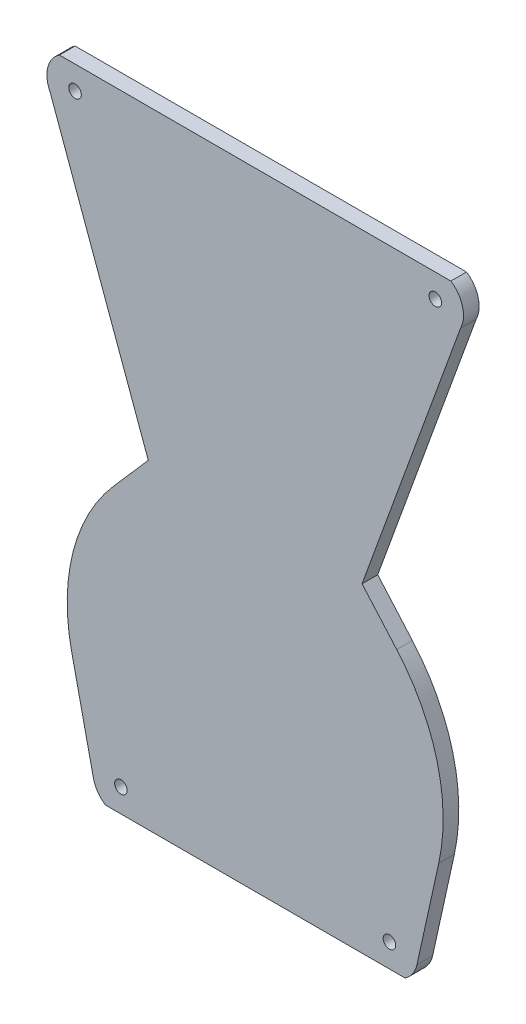
ISO-10303-21;
HEADER;
FILE_DESCRIPTION(('STEP AP214'),'2;1');
FILE_NAME('part.step','',(''),(''),'','','');
FILE_SCHEMA(('AUTOMOTIVE_DESIGN { 1 0 10303 214 1 1 1 1 }'));
ENDSEC;
DATA;
#1=APPLICATION_CONTEXT('core data for automotive mechanical design processes');
#2=APPLICATION_PROTOCOL_DEFINITION('international standard','automotive_design',2000,#1);
#3=PRODUCT_CONTEXT('',#1,'mechanical');
#4=PRODUCT('Part','Part','',(#3));
#5=PRODUCT_RELATED_PRODUCT_CATEGORY('part','',(#4));
#6=PRODUCT_DEFINITION_FORMATION('','',#4);
#7=PRODUCT_DEFINITION_CONTEXT('part definition',#1,'design');
#8=PRODUCT_DEFINITION('design','',#6,#7);
#9=PRODUCT_DEFINITION_SHAPE('','',#8);
#10=(LENGTH_UNIT() NAMED_UNIT(*) SI_UNIT(.MILLI.,.METRE.));
#11=(NAMED_UNIT(*) PLANE_ANGLE_UNIT() SI_UNIT($,.RADIAN.));
#12=(NAMED_UNIT(*) SI_UNIT($,.STERADIAN.) SOLID_ANGLE_UNIT());
#13=UNCERTAINTY_MEASURE_WITH_UNIT(LENGTH_MEASURE(1.E-05),#10,'distance_accuracy_value','');
#14=(GEOMETRIC_REPRESENTATION_CONTEXT(3) GLOBAL_UNCERTAINTY_ASSIGNED_CONTEXT((#13)) GLOBAL_UNIT_ASSIGNED_CONTEXT((#10,
#11,#12)) REPRESENTATION_CONTEXT('',''));
#15=CARTESIAN_POINT('',(0.,0.,0.));
#16=DIRECTION('',(0.,0.,1.));
#17=DIRECTION('',(1.,0.,0.));
#18=AXIS2_PLACEMENT_3D('',#15,#16,#17);
#19=CARTESIAN_POINT('',(0.,0.,0.));
#20=DIRECTION('',(0.,0.,1.));
#21=DIRECTION('',(1.,0.,0.));
#22=AXIS2_PLACEMENT_3D('',#19,#20,#21);
#23=PLANE('',#22);
#24=DIRECTION('',(1.,0.,0.));
#25=VECTOR('',#24,1.);
#26=CARTESIAN_POINT('',(-1.85657584316205E-13,100.,0.));
#27=LINE('',#26,#25);
#28=CARTESIAN_POINT('',(-62.4749371855333,100.,0.));
#29=VERTEX_POINT('',#28);
#30=CARTESIAN_POINT('',(62.474937185533,100.,0.));
#31=VERTEX_POINT('',#30);
#32=EDGE_CURVE('E271',#29,#31,#27,.T.);
#33=ORIENTED_EDGE('',*,*,#32,.T.);
#34=CARTESIAN_POINT('',(57.4999999999999,92.5,0.));
#35=DIRECTION('',(0.,0.,1.));
#36=DIRECTION('',(1.,0.,0.));
#37=AXIS2_PLACEMENT_3D('',#34,#35,#36);
#38=CIRCLE('',#37,9.);
#39=CARTESIAN_POINT('',(65.5369703494013,88.4494312000852,0.));
#40=VERTEX_POINT('',#39);
#41=EDGE_CURVE('E212',#40,#31,#38,.T.);
#42=ORIENTED_EDGE('',*,*,#41,.F.);
#43=DIRECTION('',(0.342020143325673,0.939692620785907,0.));
#44=VECTOR('',#43,1.);
#45=CARTESIAN_POINT('',(29.4435019225878,-10.7165582923818,0.));
#46=LINE('',#45,#44);
#47=CARTESIAN_POINT('',(34.1202353646952,2.13266123661636,0.));
#48=VERTEX_POINT('',#47);
#49=EDGE_CURVE('E307',#48,#40,#46,.T.);
#50=ORIENTED_EDGE('',*,*,#49,.F.);
#51=DIRECTION('',(-0.658159557923822,0.752878473801396,0.));
#52=VECTOR('',#51,1.);
#53=CARTESIAN_POINT('',(20.3970002537093,17.8308732911052,0.));
#54=LINE('',#53,#52);
#55=CARTESIAN_POINT('',(45.1727084280837,-10.5104265245707,0.));
#56=VERTEX_POINT('',#55);
#57=EDGE_CURVE('E304',#56,#48,#54,.T.);
#58=ORIENTED_EDGE('',*,*,#57,.F.);
#59=CARTESIAN_POINT('',(-1.69309011255336E-13,-50.,0.));
#60=DIRECTION('',(0.,0.,1.));
#61=DIRECTION('',(1.,0.,0.));
#62=AXIS2_PLACEMENT_3D('',#59,#60,#61);
#63=CIRCLE('',#62,60.0000000000001);
#64=CARTESIAN_POINT('',(58.5930949635311,-62.9170129130004,0.));
#65=VERTEX_POINT('',#64);
#66=EDGE_CURVE('E301',#65,#56,#63,.T.);
#67=ORIENTED_EDGE('',*,*,#66,.F.);
#68=DIRECTION('',(-0.215283548550007,-0.976551582725519,0.));
#69=VECTOR('',#68,1.);
#70=CARTESIAN_POINT('',(69.1048694670948,-15.2343632268145,0.));
#71=LINE('',#70,#69);
#72=CARTESIAN_POINT('',(51.6443033038567,-94.4375519369501,0.));
#73=VERTEX_POINT('',#72);
#74=EDGE_CURVE('E298',#65,#73,#71,.T.);
#75=ORIENTED_EDGE('',*,*,#74,.T.);
#76=CARTESIAN_POINT('',(42.855339059327,-92.5,0.));
#77=DIRECTION('',(0.,0.,1.));
#78=DIRECTION('',(1.,0.,0.));
#79=AXIS2_PLACEMENT_3D('',#76,#77,#78);
#80=CIRCLE('',#79,9.00000000000002);
#81=CARTESIAN_POINT('',(47.8302762448602,-100.,0.));
#82=VERTEX_POINT('',#81);
#83=EDGE_CURVE('E295',#82,#73,#80,.T.);
#84=ORIENTED_EDGE('',*,*,#83,.F.);
#85=DIRECTION('',(-1.,0.,0.));
#86=VECTOR('',#85,1.);
#87=CARTESIAN_POINT('',(0.,-100.,0.));
#88=LINE('',#87,#86);
#89=CARTESIAN_POINT('',(-47.8302762448605,-100.,0.));
#90=VERTEX_POINT('',#89);
#91=EDGE_CURVE('E292',#82,#90,#88,.T.);
#92=ORIENTED_EDGE('',*,*,#91,.T.);
#93=CARTESIAN_POINT('',(-42.8553390593273,-92.5,0.));
#94=DIRECTION('',(0.,0.,1.));
#95=DIRECTION('',(1.,0.,0.));
#96=AXIS2_PLACEMENT_3D('',#93,#94,#95);
#97=CIRCLE('',#96,9.00000000000002);
#98=CARTESIAN_POINT('',(-51.6443033038571,-94.4375519369501,0.));
#99=VERTEX_POINT('',#98);
#100=EDGE_CURVE('E289',#99,#90,#97,.T.);
#101=ORIENTED_EDGE('',*,*,#100,.F.);
#102=DIRECTION('',(-0.215283548550006,0.976551582725519,0.));
#103=VECTOR('',#102,1.);
#104=CARTESIAN_POINT('',(-69.1048694670951,-15.2343632268146,0.));
#105=LINE('',#104,#103);
#106=CARTESIAN_POINT('',(-58.5930949635314,-62.9170129130004,0.));
#107=VERTEX_POINT('',#106);
#108=EDGE_CURVE('E286',#99,#107,#105,.T.);
#109=ORIENTED_EDGE('',*,*,#108,.T.);
#110=CARTESIAN_POINT('',(-1.69309011255336E-13,-50.,0.));
#111=DIRECTION('',(0.,0.,1.));
#112=DIRECTION('',(1.,0.,0.));
#113=AXIS2_PLACEMENT_3D('',#110,#111,#112);
#114=CIRCLE('',#113,60.);
#115=CARTESIAN_POINT('',(-45.172708428084,-10.5104265245707,0.));
#116=VERTEX_POINT('',#115);
#117=EDGE_CURVE('E283',#116,#107,#114,.T.);
#118=ORIENTED_EDGE('',*,*,#117,.F.);
#119=DIRECTION('',(-0.658159557923822,-0.752878473801396,0.));
#120=VECTOR('',#119,1.);
#121=CARTESIAN_POINT('',(-20.3970002537094,17.8308732911054,0.));
#122=LINE('',#121,#120);
#123=CARTESIAN_POINT('',(-34.1202353646955,2.13266123661635,0.));
#124=VERTEX_POINT('',#123);
#125=EDGE_CURVE('E280',#124,#116,#122,.T.);
#126=ORIENTED_EDGE('',*,*,#125,.F.);
#127=DIRECTION('',(0.342020143325673,-0.939692620785907,0.));
#128=VECTOR('',#127,1.);
#129=CARTESIAN_POINT('',(-29.4435019225881,-10.7165582923819,0.));
#130=LINE('',#129,#128);
#131=CARTESIAN_POINT('',(-65.5369703494016,88.4494312000852,0.));
#132=VERTEX_POINT('',#131);
#133=EDGE_CURVE('E277',#132,#124,#130,.T.);
#134=ORIENTED_EDGE('',*,*,#133,.F.);
#135=CARTESIAN_POINT('',(-57.5000000000002,92.5,0.));
#136=DIRECTION('',(0.,0.,1.));
#137=DIRECTION('',(1.,0.,0.));
#138=AXIS2_PLACEMENT_3D('',#135,#136,#137);
#139=CIRCLE('',#138,9.);
#140=EDGE_CURVE('E274',#29,#132,#139,.T.);
#141=ORIENTED_EDGE('',*,*,#140,.F.);
#142=EDGE_LOOP('',(#33,#42,#50,#58,#67,#75,#84,#92,#101,#109,#118,#126,#134,#141));
#143=FACE_BOUND('',#142,.T.);
#144=CARTESIAN_POINT('',(-42.8553390593273,-92.5,0.));
#145=DIRECTION('',(0.,0.,1.));
#146=DIRECTION('',(1.,0.,0.));
#147=AXIS2_PLACEMENT_3D('',#144,#145,#146);
#148=CIRCLE('',#147,2.);
#149=CARTESIAN_POINT('',(-40.8553390593273,-92.5,0.));
#150=VERTEX_POINT('',#149);
#151=EDGE_CURVE('E268',#150,#150,#148,.T.);
#152=ORIENTED_EDGE('',*,*,#151,.T.);
#153=EDGE_LOOP('',(#152));
#154=FACE_BOUND('',#153,.T.);
#155=CARTESIAN_POINT('',(42.855339059327,-92.5,0.));
#156=DIRECTION('',(0.,0.,1.));
#157=DIRECTION('',(1.,0.,0.));
#158=AXIS2_PLACEMENT_3D('',#155,#156,#157);
#159=CIRCLE('',#158,2.);
#160=CARTESIAN_POINT('',(44.855339059327,-92.5,0.));
#161=VERTEX_POINT('',#160);
#162=EDGE_CURVE('E265',#161,#161,#159,.T.);
#163=ORIENTED_EDGE('',*,*,#162,.T.);
#164=EDGE_LOOP('',(#163));
#165=FACE_BOUND('',#164,.T.);
#166=CARTESIAN_POINT('',(57.4999999999999,92.5,0.));
#167=DIRECTION('',(0.,0.,1.));
#168=DIRECTION('',(1.,0.,0.));
#169=AXIS2_PLACEMENT_3D('',#166,#167,#168);
#170=CIRCLE('',#169,2.00000000000004);
#171=CARTESIAN_POINT('',(59.5,92.5,0.));
#172=VERTEX_POINT('',#171);
#173=EDGE_CURVE('E262',#172,#172,#170,.T.);
#174=ORIENTED_EDGE('',*,*,#173,.T.);
#175=EDGE_LOOP('',(#174));
#176=FACE_BOUND('',#175,.T.);
#177=CARTESIAN_POINT('',(-57.5000000000002,92.5,0.));
#178=DIRECTION('',(0.,0.,1.));
#179=DIRECTION('',(1.,0.,0.));
#180=AXIS2_PLACEMENT_3D('',#177,#178,#179);
#181=CIRCLE('',#180,1.99999999999979);
#182=CARTESIAN_POINT('',(-55.5000000000004,92.5,0.));
#183=VERTEX_POINT('',#182);
#184=EDGE_CURVE('E180',#183,#183,#181,.T.);
#185=ORIENTED_EDGE('',*,*,#184,.T.);
#186=EDGE_LOOP('',(#185));
#187=FACE_BOUND('',#186,.T.);
#188=DIRECTION('',(-0.342020143325666,-0.939692620785909,0.));
#189=VECTOR('',#188,1.);
#190=CARTESIAN_POINT('',(19.5767294043364,-7.1253467874623,0.));
#191=LINE('',#190,#189);
#192=CARTESIAN_POINT('',(25.8705075921699,10.1666666666665,0.));
#193=VERTEX_POINT('',#192);
#194=CARTESIAN_POINT('',(24.2534628464436,5.72387274153576,0.));
#195=VERTEX_POINT('',#194);
#196=EDGE_CURVE('E184',#193,#195,#191,.T.);
#197=ORIENTED_EDGE('',*,*,#196,.F.);
#198=DIRECTION('',(-1.,0.,0.));
#199=VECTOR('',#198,1.);
#200=CARTESIAN_POINT('',(0.,10.1666666666665,0.));
#201=LINE('',#200,#199);
#202=CARTESIAN_POINT('',(-25.8705075921697,10.1666666666665,0.));
#203=VERTEX_POINT('',#202);
#204=EDGE_CURVE('E201',#193,#203,#201,.T.);
#205=ORIENTED_EDGE('',*,*,#204,.T.);
#206=DIRECTION('',(0.342020143325672,-0.939692620785907,0.));
#207=VECTOR('',#206,1.);
#208=CARTESIAN_POINT('',(-19.5767294043361,-7.12534678746233,0.));
#209=LINE('',#208,#207);
#210=CARTESIAN_POINT('',(-24.2534628464435,5.72387274153591,0.));
#211=VERTEX_POINT('',#210);
#212=EDGE_CURVE('E198',#203,#211,#209,.T.);
#213=ORIENTED_EDGE('',*,*,#212,.T.);
#214=CARTESIAN_POINT('',(-34.1202353646955,2.13266123661635,0.));
#215=DIRECTION('',(0.,0.,-1.));
#216=DIRECTION('',(-1.,0.,0.));
#217=AXIS2_PLACEMENT_3D('',#214,#215,#216);
#218=CIRCLE('',#217,10.5);
#219=CARTESIAN_POINT('',(-23.7479445238807,0.500000000000013,0.));
#220=VERTEX_POINT('',#219);
#221=EDGE_CURVE('E194',#211,#220,#218,.T.);
#222=ORIENTED_EDGE('',*,*,#221,.T.);
#223=DIRECTION('',(-1.,0.,0.));
#224=VECTOR('',#223,1.);
#225=CARTESIAN_POINT('',(0.,0.500000000000013,0.));
#226=LINE('',#225,#224);
#227=CARTESIAN_POINT('',(23.7479445238809,0.500000000000013,0.));
#228=VERTEX_POINT('',#227);
#229=EDGE_CURVE('E192',#228,#220,#226,.T.);
#230=ORIENTED_EDGE('',*,*,#229,.F.);
#231=CARTESIAN_POINT('',(34.1202353646957,2.13266123661626,0.));
#232=DIRECTION('',(0.,0.,-1.));
#233=DIRECTION('',(-1.,0.,0.));
#234=AXIS2_PLACEMENT_3D('',#231,#232,#233);
#235=CIRCLE('',#234,10.5);
#236=EDGE_CURVE('E176',#195,#228,#235,.F.);
#237=ORIENTED_EDGE('',*,*,#236,.F.);
#238=EDGE_LOOP('',(#197,#205,#213,#222,#230,#237));
#239=FACE_BOUND('',#238,.T.);
#240=ADVANCED_FACE('F43',(#143,#154,#165,#176,#187,#239),#23,.F.);
#241=CARTESIAN_POINT('',(-1.85657584316205E-13,100.,5.));
#242=DIRECTION('',(0.,1.,0.));
#243=DIRECTION('',(-1.,0.,0.));
#244=AXIS2_PLACEMENT_3D('',#241,#242,#243);
#245=PLANE('',#244);
#246=ORIENTED_EDGE('',*,*,#32,.F.);
#247=DIRECTION('',(0.,0.,-1.));
#248=VECTOR('',#247,1.);
#249=CARTESIAN_POINT('',(-62.4749371855333,100.,5.));
#250=LINE('',#249,#248);
#251=CARTESIAN_POINT('',(-62.4749371855333,100.,5.));
#252=VERTEX_POINT('',#251);
#253=EDGE_CURVE('E343',#252,#29,#250,.T.);
#254=ORIENTED_EDGE('',*,*,#253,.F.);
#255=DIRECTION('',(1.,0.,0.));
#256=VECTOR('',#255,1.);
#257=CARTESIAN_POINT('',(-1.85657584316205E-13,100.,5.));
#258=LINE('',#257,#256);
#259=CARTESIAN_POINT('',(62.474937185533,100.,5.));
#260=VERTEX_POINT('',#259);
#261=EDGE_CURVE('E221',#252,#260,#258,.T.);
#262=ORIENTED_EDGE('',*,*,#261,.T.);
#263=DIRECTION('',(0.,0.,-1.));
#264=VECTOR('',#263,1.);
#265=CARTESIAN_POINT('',(62.474937185533,100.,5.));
#266=LINE('',#265,#264);
#267=EDGE_CURVE('E259',#260,#31,#266,.T.);
#268=ORIENTED_EDGE('',*,*,#267,.T.);
#269=EDGE_LOOP('',(#246,#254,#262,#268));
#270=FACE_BOUND('',#269,.T.);
#271=ADVANCED_FACE('F367',(#270),#245,.T.);
#272=CARTESIAN_POINT('',(-57.5000000000002,92.5,5.));
#273=DIRECTION('',(0.,0.,-1.));
#274=DIRECTION('',(-1.,0.,0.));
#275=AXIS2_PLACEMENT_3D('',#272,#273,#274);
#276=CYLINDRICAL_SURFACE('',#275,9.);
#277=ORIENTED_EDGE('',*,*,#140,.T.);
#278=DIRECTION('',(0.,0.,-1.));
#279=VECTOR('',#278,1.);
#280=CARTESIAN_POINT('',(-65.5369703494016,88.4494312000852,5.));
#281=LINE('',#280,#279);
#282=CARTESIAN_POINT('',(-65.5369703494016,88.4494312000852,5.));
#283=VERTEX_POINT('',#282);
#284=EDGE_CURVE('E340',#283,#132,#281,.T.);
#285=ORIENTED_EDGE('',*,*,#284,.F.);
#286=CARTESIAN_POINT('',(-57.5000000000002,92.5,5.));
#287=DIRECTION('',(0.,0.,1.));
#288=DIRECTION('',(1.,0.,0.));
#289=AXIS2_PLACEMENT_3D('',#286,#287,#288);
#290=CIRCLE('',#289,9.);
#291=EDGE_CURVE('E224',#252,#283,#290,.T.);
#292=ORIENTED_EDGE('',*,*,#291,.F.);
#293=ORIENTED_EDGE('',*,*,#253,.T.);
#294=EDGE_LOOP('',(#277,#285,#292,#293));
#295=FACE_BOUND('',#294,.T.);
#296=ADVANCED_FACE('F375',(#295),#276,.T.);
#297=CARTESIAN_POINT('',(-29.4435019225881,-10.7165582923819,5.));
#298=DIRECTION('',(0.939692620785907,0.342020143325673,0.));
#299=DIRECTION('',(-0.342020143325673,0.939692620785907,0.));
#300=AXIS2_PLACEMENT_3D('',#297,#298,#299);
#301=PLANE('',#300);
#302=ORIENTED_EDGE('',*,*,#133,.T.);
#303=DIRECTION('',(0.,0.,-1.));
#304=VECTOR('',#303,1.);
#305=CARTESIAN_POINT('',(-34.1202353646955,2.13266123661635,5.));
#306=LINE('',#305,#304);
#307=CARTESIAN_POINT('',(-34.1202353646955,2.13266123661635,5.));
#308=VERTEX_POINT('',#307);
#309=EDGE_CURVE('E337',#308,#124,#306,.T.);
#310=ORIENTED_EDGE('',*,*,#309,.F.);
#311=DIRECTION('',(0.342020143325673,-0.939692620785907,0.));
#312=VECTOR('',#311,1.);
#313=CARTESIAN_POINT('',(-29.4435019225881,-10.7165582923819,5.));
#314=LINE('',#313,#312);
#315=EDGE_CURVE('E227',#283,#308,#314,.T.);
#316=ORIENTED_EDGE('',*,*,#315,.F.);
#317=ORIENTED_EDGE('',*,*,#284,.T.);
#318=EDGE_LOOP('',(#302,#310,#316,#317));
#319=FACE_BOUND('',#318,.T.);
#320=ADVANCED_FACE('F428',(#319),#301,.F.);
#321=CARTESIAN_POINT('',(-20.3970002537094,17.8308732911054,5.));
#322=DIRECTION('',(0.752878473801396,-0.658159557923822,0.));
#323=DIRECTION('',(0.658159557923822,0.752878473801396,0.));
#324=AXIS2_PLACEMENT_3D('',#321,#322,#323);
#325=PLANE('',#324);
#326=ORIENTED_EDGE('',*,*,#125,.T.);
#327=DIRECTION('',(0.,0.,-1.));
#328=VECTOR('',#327,1.);
#329=CARTESIAN_POINT('',(-45.172708428084,-10.5104265245707,5.));
#330=LINE('',#329,#328);
#331=CARTESIAN_POINT('',(-45.172708428084,-10.5104265245707,5.));
#332=VERTEX_POINT('',#331);
#333=EDGE_CURVE('E334',#332,#116,#330,.T.);
#334=ORIENTED_EDGE('',*,*,#333,.F.);
#335=DIRECTION('',(-0.658159557923822,-0.752878473801396,0.));
#336=VECTOR('',#335,1.);
#337=CARTESIAN_POINT('',(-20.3970002537094,17.8308732911054,5.));
#338=LINE('',#337,#336);
#339=EDGE_CURVE('E230',#308,#332,#338,.T.);
#340=ORIENTED_EDGE('',*,*,#339,.F.);
#341=ORIENTED_EDGE('',*,*,#309,.T.);
#342=EDGE_LOOP('',(#326,#334,#340,#341));
#343=FACE_BOUND('',#342,.T.);
#344=ADVANCED_FACE('F424',(#343),#325,.F.);
#345=CARTESIAN_POINT('',(-1.69309011255336E-13,-50.,5.));
#346=DIRECTION('',(0.,0.,-1.));
#347=DIRECTION('',(-1.,0.,0.));
#348=AXIS2_PLACEMENT_3D('',#345,#346,#347);
#349=CYLINDRICAL_SURFACE('',#348,60.);
#350=ORIENTED_EDGE('',*,*,#117,.T.);
#351=DIRECTION('',(0.,0.,-1.));
#352=VECTOR('',#351,1.);
#353=CARTESIAN_POINT('',(-58.5930949635314,-62.9170129130004,5.));
#354=LINE('',#353,#352);
#355=CARTESIAN_POINT('',(-58.5930949635314,-62.9170129130004,5.));
#356=VERTEX_POINT('',#355);
#357=EDGE_CURVE('E332',#356,#107,#354,.T.);
#358=ORIENTED_EDGE('',*,*,#357,.F.);
#359=CARTESIAN_POINT('',(-1.69309011255336E-13,-50.,5.));
#360=DIRECTION('',(0.,0.,1.));
#361=DIRECTION('',(1.,0.,0.));
#362=AXIS2_PLACEMENT_3D('',#359,#360,#361);
#363=CIRCLE('',#362,60.);
#364=EDGE_CURVE('E233',#332,#356,#363,.T.);
#365=ORIENTED_EDGE('',*,*,#364,.F.);
#366=ORIENTED_EDGE('',*,*,#333,.T.);
#367=EDGE_LOOP('',(#350,#358,#365,#366));
#368=FACE_BOUND('',#367,.T.);
#369=ADVANCED_FACE('F420',(#368),#349,.T.);
#370=CARTESIAN_POINT('',(-69.1048694670951,-15.2343632268146,5.));
#371=DIRECTION('',(-0.97655158272552,-0.215283548550006,0.));
#372=DIRECTION('',(0.215283548550006,-0.97655158272552,0.));
#373=AXIS2_PLACEMENT_3D('',#370,#371,#372);
#374=PLANE('',#373);
#375=ORIENTED_EDGE('',*,*,#108,.F.);
#376=DIRECTION('',(0.,0.,-1.));
#377=VECTOR('',#376,1.);
#378=CARTESIAN_POINT('',(-51.6443033038571,-94.4375519369501,5.));
#379=LINE('',#378,#377);
#380=CARTESIAN_POINT('',(-51.6443033038571,-94.4375519369501,5.));
#381=VERTEX_POINT('',#380);
#382=EDGE_CURVE('E330',#381,#99,#379,.T.);
#383=ORIENTED_EDGE('',*,*,#382,.F.);
#384=DIRECTION('',(-0.215283548550006,0.976551582725519,0.));
#385=VECTOR('',#384,1.);
#386=CARTESIAN_POINT('',(-69.1048694670951,-15.2343632268146,5.));
#387=LINE('',#386,#385);
#388=EDGE_CURVE('E235',#381,#356,#387,.T.);
#389=ORIENTED_EDGE('',*,*,#388,.T.);
#390=ORIENTED_EDGE('',*,*,#357,.T.);
#391=EDGE_LOOP('',(#375,#383,#389,#390));
#392=FACE_BOUND('',#391,.T.);
#393=ADVANCED_FACE('F416',(#392),#374,.T.);
#394=CARTESIAN_POINT('',(-42.8553390593273,-92.5,5.));
#395=DIRECTION('',(0.,0.,-1.));
#396=DIRECTION('',(-1.,0.,0.));
#397=AXIS2_PLACEMENT_3D('',#394,#395,#396);
#398=CYLINDRICAL_SURFACE('',#397,9.00000000000002);
#399=ORIENTED_EDGE('',*,*,#100,.T.);
#400=DIRECTION('',(0.,0.,-1.));
#401=VECTOR('',#400,1.);
#402=CARTESIAN_POINT('',(-47.8302762448605,-100.,5.));
#403=LINE('',#402,#401);
#404=CARTESIAN_POINT('',(-47.8302762448605,-100.,5.));
#405=VERTEX_POINT('',#404);
#406=EDGE_CURVE('E328',#405,#90,#403,.T.);
#407=ORIENTED_EDGE('',*,*,#406,.F.);
#408=CARTESIAN_POINT('',(-42.8553390593273,-92.5,5.));
#409=DIRECTION('',(0.,0.,1.));
#410=DIRECTION('',(1.,0.,0.));
#411=AXIS2_PLACEMENT_3D('',#408,#409,#410);
#412=CIRCLE('',#411,9.00000000000002);
#413=EDGE_CURVE('E238',#381,#405,#412,.T.);
#414=ORIENTED_EDGE('',*,*,#413,.F.);
#415=ORIENTED_EDGE('',*,*,#382,.T.);
#416=EDGE_LOOP('',(#399,#407,#414,#415));
#417=FACE_BOUND('',#416,.T.);
#418=ADVANCED_FACE('F412',(#417),#398,.T.);
#419=CARTESIAN_POINT('',(0.,-100.,5.));
#420=DIRECTION('',(0.,-1.,0.));
#421=DIRECTION('',(0.,0.,-1.));
#422=AXIS2_PLACEMENT_3D('',#419,#420,#421);
#423=PLANE('',#422);
#424=ORIENTED_EDGE('',*,*,#91,.F.);
#425=DIRECTION('',(0.,0.,-1.));
#426=VECTOR('',#425,1.);
#427=CARTESIAN_POINT('',(47.8302762448602,-100.,5.));
#428=LINE('',#427,#426);
#429=CARTESIAN_POINT('',(47.8302762448602,-100.,5.));
#430=VERTEX_POINT('',#429);
#431=EDGE_CURVE('E326',#430,#82,#428,.T.);
#432=ORIENTED_EDGE('',*,*,#431,.F.);
#433=DIRECTION('',(-1.,0.,0.));
#434=VECTOR('',#433,1.);
#435=CARTESIAN_POINT('',(0.,-100.,5.));
#436=LINE('',#435,#434);
#437=EDGE_CURVE('E240',#430,#405,#436,.T.);
#438=ORIENTED_EDGE('',*,*,#437,.T.);
#439=ORIENTED_EDGE('',*,*,#406,.T.);
#440=EDGE_LOOP('',(#424,#432,#438,#439));
#441=FACE_BOUND('',#440,.T.);
#442=ADVANCED_FACE('F408',(#441),#423,.T.);
#443=CARTESIAN_POINT('',(42.855339059327,-92.5,5.));
#444=DIRECTION('',(0.,0.,-1.));
#445=DIRECTION('',(-1.,0.,0.));
#446=AXIS2_PLACEMENT_3D('',#443,#444,#445);
#447=CYLINDRICAL_SURFACE('',#446,9.00000000000002);
#448=ORIENTED_EDGE('',*,*,#83,.T.);
#449=DIRECTION('',(0.,0.,-1.));
#450=VECTOR('',#449,1.);
#451=CARTESIAN_POINT('',(51.6443033038567,-94.4375519369501,5.));
#452=LINE('',#451,#450);
#453=CARTESIAN_POINT('',(51.6443033038567,-94.4375519369501,5.));
#454=VERTEX_POINT('',#453);
#455=EDGE_CURVE('E324',#454,#73,#452,.T.);
#456=ORIENTED_EDGE('',*,*,#455,.F.);
#457=CARTESIAN_POINT('',(42.855339059327,-92.5,5.));
#458=DIRECTION('',(0.,0.,1.));
#459=DIRECTION('',(1.,0.,0.));
#460=AXIS2_PLACEMENT_3D('',#457,#458,#459);
#461=CIRCLE('',#460,9.00000000000002);
#462=EDGE_CURVE('E243',#430,#454,#461,.T.);
#463=ORIENTED_EDGE('',*,*,#462,.F.);
#464=ORIENTED_EDGE('',*,*,#431,.T.);
#465=EDGE_LOOP('',(#448,#456,#463,#464));
#466=FACE_BOUND('',#465,.T.);
#467=ADVANCED_FACE('F404',(#466),#447,.T.);
#468=CARTESIAN_POINT('',(69.1048694670948,-15.2343632268145,5.));
#469=DIRECTION('',(0.976551582725519,-0.215283548550007,0.));
#470=DIRECTION('',(0.215283548550007,0.976551582725519,0.));
#471=AXIS2_PLACEMENT_3D('',#468,#469,#470);
#472=PLANE('',#471);
#473=ORIENTED_EDGE('',*,*,#74,.F.);
#474=DIRECTION('',(0.,0.,-1.));
#475=VECTOR('',#474,1.);
#476=CARTESIAN_POINT('',(58.5930949635311,-62.9170129130004,5.));
#477=LINE('',#476,#475);
#478=CARTESIAN_POINT('',(58.5930949635311,-62.9170129130004,5.));
#479=VERTEX_POINT('',#478);
#480=EDGE_CURVE('E322',#479,#65,#477,.T.);
#481=ORIENTED_EDGE('',*,*,#480,.F.);
#482=DIRECTION('',(-0.215283548550007,-0.976551582725519,0.));
#483=VECTOR('',#482,1.);
#484=CARTESIAN_POINT('',(69.1048694670948,-15.2343632268145,5.));
#485=LINE('',#484,#483);
#486=EDGE_CURVE('E245',#479,#454,#485,.T.);
#487=ORIENTED_EDGE('',*,*,#486,.T.);
#488=ORIENTED_EDGE('',*,*,#455,.T.);
#489=EDGE_LOOP('',(#473,#481,#487,#488));
#490=FACE_BOUND('',#489,.T.);
#491=ADVANCED_FACE('F400',(#490),#472,.T.);
#492=CARTESIAN_POINT('',(-1.69309011255336E-13,-50.,5.));
#493=DIRECTION('',(0.,0.,-1.));
#494=DIRECTION('',(-1.,0.,0.));
#495=AXIS2_PLACEMENT_3D('',#492,#493,#494);
#496=CYLINDRICAL_SURFACE('',#495,60.0000000000001);
#497=ORIENTED_EDGE('',*,*,#66,.T.);
#498=DIRECTION('',(0.,0.,-1.));
#499=VECTOR('',#498,1.);
#500=CARTESIAN_POINT('',(45.1727084280837,-10.5104265245707,5.));
#501=LINE('',#500,#499);
#502=CARTESIAN_POINT('',(45.1727084280837,-10.5104265245707,5.));
#503=VERTEX_POINT('',#502);
#504=EDGE_CURVE('E319',#503,#56,#501,.T.);
#505=ORIENTED_EDGE('',*,*,#504,.F.);
#506=CARTESIAN_POINT('',(-1.69309011255336E-13,-50.,5.));
#507=DIRECTION('',(0.,0.,1.));
#508=DIRECTION('',(1.,0.,0.));
#509=AXIS2_PLACEMENT_3D('',#506,#507,#508);
#510=CIRCLE('',#509,60.0000000000001);
#511=EDGE_CURVE('E248',#479,#503,#510,.T.);
#512=ORIENTED_EDGE('',*,*,#511,.F.);
#513=ORIENTED_EDGE('',*,*,#480,.T.);
#514=EDGE_LOOP('',(#497,#505,#512,#513));
#515=FACE_BOUND('',#514,.T.);
#516=ADVANCED_FACE('F396',(#515),#496,.T.);
#517=CARTESIAN_POINT('',(20.3970002537093,17.8308732911052,5.));
#518=DIRECTION('',(-0.752878473801396,-0.658159557923822,0.));
#519=DIRECTION('',(0.658159557923822,-0.752878473801396,0.));
#520=AXIS2_PLACEMENT_3D('',#517,#518,#519);
#521=PLANE('',#520);
#522=ORIENTED_EDGE('',*,*,#57,.T.);
#523=DIRECTION('',(0.,0.,-1.));
#524=VECTOR('',#523,1.);
#525=CARTESIAN_POINT('',(34.1202353646952,2.13266123661636,5.));
#526=LINE('',#525,#524);
#527=CARTESIAN_POINT('',(34.1202353646952,2.13266123661636,5.));
#528=VERTEX_POINT('',#527);
#529=EDGE_CURVE('E316',#528,#48,#526,.T.);
#530=ORIENTED_EDGE('',*,*,#529,.F.);
#531=DIRECTION('',(-0.658159557923822,0.752878473801396,0.));
#532=VECTOR('',#531,1.);
#533=CARTESIAN_POINT('',(20.3970002537093,17.8308732911052,5.));
#534=LINE('',#533,#532);
#535=EDGE_CURVE('E251',#503,#528,#534,.T.);
#536=ORIENTED_EDGE('',*,*,#535,.F.);
#537=ORIENTED_EDGE('',*,*,#504,.T.);
#538=EDGE_LOOP('',(#522,#530,#536,#537));
#539=FACE_BOUND('',#538,.T.);
#540=ADVANCED_FACE('F392',(#539),#521,.F.);
#541=CARTESIAN_POINT('',(29.4435019225878,-10.7165582923818,5.));
#542=DIRECTION('',(-0.939692620785907,0.342020143325673,0.));
#543=DIRECTION('',(-0.342020143325673,-0.939692620785907,0.));
#544=AXIS2_PLACEMENT_3D('',#541,#542,#543);
#545=PLANE('',#544);
#546=ORIENTED_EDGE('',*,*,#49,.T.);
#547=DIRECTION('',(0.,0.,-1.));
#548=VECTOR('',#547,1.);
#549=CARTESIAN_POINT('',(65.5369703494013,88.4494312000852,5.));
#550=LINE('',#549,#548);
#551=CARTESIAN_POINT('',(65.5369703494013,88.4494312000852,5.));
#552=VERTEX_POINT('',#551);
#553=EDGE_CURVE('E313',#552,#40,#550,.T.);
#554=ORIENTED_EDGE('',*,*,#553,.F.);
#555=DIRECTION('',(0.342020143325673,0.939692620785907,0.));
#556=VECTOR('',#555,1.);
#557=CARTESIAN_POINT('',(29.4435019225878,-10.7165582923818,5.));
#558=LINE('',#557,#556);
#559=EDGE_CURVE('E254',#528,#552,#558,.T.);
#560=ORIENTED_EDGE('',*,*,#559,.F.);
#561=ORIENTED_EDGE('',*,*,#529,.T.);
#562=EDGE_LOOP('',(#546,#554,#560,#561));
#563=FACE_BOUND('',#562,.T.);
#564=ADVANCED_FACE('F388',(#563),#545,.F.);
#565=CARTESIAN_POINT('',(-42.8553390593273,-92.5,5.));
#566=DIRECTION('',(0.,0.,-1.));
#567=DIRECTION('',(-1.,0.,0.));
#568=AXIS2_PLACEMENT_3D('',#565,#566,#567);
#569=CYLINDRICAL_SURFACE('',#568,2.);
#570=CARTESIAN_POINT('',(-42.8553390593273,-92.5,5.));
#571=DIRECTION('',(0.,0.,1.));
#572=DIRECTION('',(1.,0.,0.));
#573=AXIS2_PLACEMENT_3D('',#570,#571,#572);
#574=CIRCLE('',#573,2.);
#575=CARTESIAN_POINT('',(-40.8553390593273,-92.5,5.));
#576=VERTEX_POINT('',#575);
#577=EDGE_CURVE('E218',#576,#576,#574,.T.);
#578=ORIENTED_EDGE('',*,*,#577,.T.);
#579=EDGE_LOOP('',(#578));
#580=FACE_BOUND('',#579,.T.);
#581=ORIENTED_EDGE('',*,*,#151,.F.);
#582=EDGE_LOOP('',(#581));
#583=FACE_BOUND('',#582,.T.);
#584=ADVANCED_FACE('F391',(#580,#583),#569,.F.);
#585=CARTESIAN_POINT('',(42.855339059327,-92.5,5.));
#586=DIRECTION('',(0.,0.,-1.));
#587=DIRECTION('',(-1.,0.,0.));
#588=AXIS2_PLACEMENT_3D('',#585,#586,#587);
#589=CYLINDRICAL_SURFACE('',#588,2.);
#590=CARTESIAN_POINT('',(42.855339059327,-92.5,5.));
#591=DIRECTION('',(0.,0.,1.));
#592=DIRECTION('',(1.,0.,0.));
#593=AXIS2_PLACEMENT_3D('',#590,#591,#592);
#594=CIRCLE('',#593,2.);
#595=CARTESIAN_POINT('',(44.855339059327,-92.5,5.));
#596=VERTEX_POINT('',#595);
#597=EDGE_CURVE('E215',#596,#596,#594,.T.);
#598=ORIENTED_EDGE('',*,*,#597,.T.);
#599=EDGE_LOOP('',(#598));
#600=FACE_BOUND('',#599,.T.);
#601=ORIENTED_EDGE('',*,*,#162,.F.);
#602=EDGE_LOOP('',(#601));
#603=FACE_BOUND('',#602,.T.);
#604=ADVANCED_FACE('F438',(#600,#603),#589,.F.);
#605=CARTESIAN_POINT('',(57.4999999999999,92.5,5.));
#606=DIRECTION('',(0.,0.,-1.));
#607=DIRECTION('',(-1.,0.,0.));
#608=AXIS2_PLACEMENT_3D('',#605,#606,#607);
#609=CYLINDRICAL_SURFACE('',#608,2.00000000000004);
#610=CARTESIAN_POINT('',(57.4999999999999,92.5,5.));
#611=DIRECTION('',(0.,0.,1.));
#612=DIRECTION('',(1.,0.,0.));
#613=AXIS2_PLACEMENT_3D('',#610,#611,#612);
#614=CIRCLE('',#613,2.00000000000004);
#615=CARTESIAN_POINT('',(59.5,92.5,5.));
#616=VERTEX_POINT('',#615);
#617=EDGE_CURVE('E211',#616,#616,#614,.T.);
#618=ORIENTED_EDGE('',*,*,#617,.T.);
#619=EDGE_LOOP('',(#618));
#620=FACE_BOUND('',#619,.T.);
#621=ORIENTED_EDGE('',*,*,#173,.F.);
#622=EDGE_LOOP('',(#621));
#623=FACE_BOUND('',#622,.T.);
#624=ADVANCED_FACE('F442',(#620,#623),#609,.F.);
#625=CARTESIAN_POINT('',(-57.5000000000002,92.5,5.));
#626=DIRECTION('',(0.,0.,-1.));
#627=DIRECTION('',(-1.,0.,0.));
#628=AXIS2_PLACEMENT_3D('',#625,#626,#627);
#629=CYLINDRICAL_SURFACE('',#628,1.99999999999979);
#630=CARTESIAN_POINT('',(-57.5000000000002,92.5,5.));
#631=DIRECTION('',(0.,0.,1.));
#632=DIRECTION('',(1.,0.,0.));
#633=AXIS2_PLACEMENT_3D('',#630,#631,#632);
#634=CIRCLE('',#633,1.99999999999979);
#635=CARTESIAN_POINT('',(-55.5000000000004,92.5,5.));
#636=VERTEX_POINT('',#635);
#637=EDGE_CURVE('E208',#636,#636,#634,.T.);
#638=ORIENTED_EDGE('',*,*,#637,.T.);
#639=EDGE_LOOP('',(#638));
#640=FACE_BOUND('',#639,.T.);
#641=ORIENTED_EDGE('',*,*,#184,.F.);
#642=EDGE_LOOP('',(#641));
#643=FACE_BOUND('',#642,.T.);
#644=ADVANCED_FACE('F386',(#640,#643),#629,.F.);
#645=CARTESIAN_POINT('',(57.4999999999999,92.5,5.));
#646=DIRECTION('',(0.,0.,-1.));
#647=DIRECTION('',(-1.,0.,0.));
#648=AXIS2_PLACEMENT_3D('',#645,#646,#647);
#649=CYLINDRICAL_SURFACE('',#648,9.);
#650=ORIENTED_EDGE('',*,*,#41,.T.);
#651=ORIENTED_EDGE('',*,*,#267,.F.);
#652=CARTESIAN_POINT('',(57.4999999999999,92.5,5.));
#653=DIRECTION('',(0.,0.,1.));
#654=DIRECTION('',(1.,0.,0.));
#655=AXIS2_PLACEMENT_3D('',#652,#653,#654);
#656=CIRCLE('',#655,9.);
#657=EDGE_CURVE('E257',#552,#260,#656,.T.);
#658=ORIENTED_EDGE('',*,*,#657,.F.);
#659=ORIENTED_EDGE('',*,*,#553,.T.);
#660=EDGE_LOOP('',(#650,#651,#658,#659));
#661=FACE_BOUND('',#660,.T.);
#662=ADVANCED_FACE('F383',(#661),#649,.T.);
#663=CARTESIAN_POINT('',(0.,0.,5.));
#664=DIRECTION('',(0.,0.,1.));
#665=DIRECTION('',(1.,0.,0.));
#666=AXIS2_PLACEMENT_3D('',#663,#664,#665);
#667=PLANE('',#666);
#668=ORIENTED_EDGE('',*,*,#637,.F.);
#669=EDGE_LOOP('',(#668));
#670=FACE_BOUND('',#669,.T.);
#671=ORIENTED_EDGE('',*,*,#617,.F.);
#672=EDGE_LOOP('',(#671));
#673=FACE_BOUND('',#672,.T.);
#674=ORIENTED_EDGE('',*,*,#597,.F.);
#675=EDGE_LOOP('',(#674));
#676=FACE_BOUND('',#675,.T.);
#677=ORIENTED_EDGE('',*,*,#577,.F.);
#678=EDGE_LOOP('',(#677));
#679=FACE_BOUND('',#678,.T.);
#680=ORIENTED_EDGE('',*,*,#261,.F.);
#681=ORIENTED_EDGE('',*,*,#291,.T.);
#682=ORIENTED_EDGE('',*,*,#315,.T.);
#683=ORIENTED_EDGE('',*,*,#339,.T.);
#684=ORIENTED_EDGE('',*,*,#364,.T.);
#685=ORIENTED_EDGE('',*,*,#388,.F.);
#686=ORIENTED_EDGE('',*,*,#413,.T.);
#687=ORIENTED_EDGE('',*,*,#437,.F.);
#688=ORIENTED_EDGE('',*,*,#462,.T.);
#689=ORIENTED_EDGE('',*,*,#486,.F.);
#690=ORIENTED_EDGE('',*,*,#511,.T.);
#691=ORIENTED_EDGE('',*,*,#535,.T.);
#692=ORIENTED_EDGE('',*,*,#559,.T.);
#693=ORIENTED_EDGE('',*,*,#657,.T.);
#694=EDGE_LOOP('',(#680,#681,#682,#683,#684,#685,#686,#687,#688,#689,#690,#691,#692,#693));
#695=FACE_BOUND('',#694,.T.);
#696=ADVANCED_FACE('F381',(#670,#673,#676,#679,#695),#667,.T.);
#697=CARTESIAN_POINT('',(19.5767294043364,-7.1253467874623,-10.));
#698=DIRECTION('',(-0.939692620785909,0.342020143325666,0.));
#699=DIRECTION('',(-0.342020143325666,-0.939692620785909,0.));
#700=AXIS2_PLACEMENT_3D('',#697,#698,#699);
#701=PLANE('',#700);
#702=DIRECTION('',(0.,0.,1.));
#703=VECTOR('',#702,1.);
#704=CARTESIAN_POINT('',(24.2534628464436,5.72387274153576,-10.));
#705=LINE('',#704,#703);
#706=CARTESIAN_POINT('',(24.2534628464436,5.72387274153576,-4.44279392513066));
#707=VERTEX_POINT('',#706);
#708=EDGE_CURVE('E172',#707,#195,#705,.T.);
#709=ORIENTED_EDGE('',*,*,#708,.F.);
#710=DIRECTION('',(-0.249243569363952,-0.684791078771736,-0.684791078771736));
#711=VECTOR('',#710,1.);
#712=CARTESIAN_POINT('',(24.2633706871396,5.75109431012358,-4.41557235654285));
#713=LINE('',#712,#711);
#714=EDGE_CURVE('E11',#707,#193,#713,.F.);
#715=ORIENTED_EDGE('',*,*,#714,.T.);
#716=ORIENTED_EDGE('',*,*,#196,.T.);
#717=EDGE_LOOP('',(#709,#715,#716));
#718=FACE_BOUND('',#717,.T.);
#719=ADVANCED_FACE('F185',(#718),#701,.F.);
#720=CARTESIAN_POINT('',(34.1202353646957,2.13266123661626,-10.));
#721=DIRECTION('',(0.,0.,1.));
#722=DIRECTION('',(1.,0.,0.));
#723=AXIS2_PLACEMENT_3D('',#720,#721,#722);
#724=CYLINDRICAL_SURFACE('',#723,10.5);
#725=DIRECTION('',(0.,0.,1.));
#726=VECTOR('',#725,1.);
#727=CARTESIAN_POINT('',(23.7479445238809,0.500000000000013,-10.));
#728=LINE('',#727,#726);
#729=CARTESIAN_POINT('',(23.7479445238809,0.500000000000013,-9.66666666666641));
#730=VERTEX_POINT('',#729);
#731=EDGE_CURVE('E181',#730,#228,#728,.T.);
#732=ORIENTED_EDGE('',*,*,#731,.F.);
#733=CARTESIAN_POINT('',(34.1202353646957,2.13266123661626,-8.03400543005017));
#734=DIRECTION('',(0.,-0.707106781186547,0.707106781186547));
#735=DIRECTION('',(0.,0.707106781186548,0.707106781186548));
#736=AXIS2_PLACEMENT_3D('',#733,#734,#735);
#737=ELLIPSE('',#736,14.8492424049175,10.5);
#738=EDGE_CURVE('E52',#730,#707,#737,.F.);
#739=ORIENTED_EDGE('',*,*,#738,.T.);
#740=ORIENTED_EDGE('',*,*,#708,.T.);
#741=ORIENTED_EDGE('',*,*,#236,.T.);
#742=EDGE_LOOP('',(#732,#739,#740,#741));
#743=FACE_BOUND('',#742,.T.);
#744=ADVANCED_FACE('F174',(#743),#724,.F.);
#745=CARTESIAN_POINT('',(0.,0.500000000000013,-10.));
#746=DIRECTION('',(0.,1.,0.));
#747=DIRECTION('',(0.,0.,1.));
#748=AXIS2_PLACEMENT_3D('',#745,#746,#747);
#749=PLANE('',#748);
#750=DIRECTION('',(0.,0.,1.));
#751=VECTOR('',#750,1.);
#752=CARTESIAN_POINT('',(-23.7479445238807,0.500000000000013,-10.));
#753=LINE('',#752,#751);
#754=CARTESIAN_POINT('',(-23.7479445238807,0.500000000000013,-9.66666666666641));
#755=VERTEX_POINT('',#754);
#756=EDGE_CURVE('E205',#755,#220,#753,.T.);
#757=ORIENTED_EDGE('',*,*,#756,.F.);
#758=DIRECTION('',(-1.,0.,0.));
#759=VECTOR('',#758,1.);
#760=CARTESIAN_POINT('',(0.,0.500000000000013,-9.66666666666641));
#761=LINE('',#760,#759);
#762=EDGE_CURVE('E66',#755,#730,#761,.F.);
#763=ORIENTED_EDGE('',*,*,#762,.T.);
#764=ORIENTED_EDGE('',*,*,#731,.T.);
#765=ORIENTED_EDGE('',*,*,#229,.T.);
#766=EDGE_LOOP('',(#757,#763,#764,#765));
#767=FACE_BOUND('',#766,.T.);
#768=ADVANCED_FACE('F355',(#767),#749,.F.);
#769=CARTESIAN_POINT('',(-34.1202353646955,2.13266123661635,-10.));
#770=DIRECTION('',(0.,0.,1.));
#771=DIRECTION('',(1.,0.,0.));
#772=AXIS2_PLACEMENT_3D('',#769,#770,#771);
#773=CYLINDRICAL_SURFACE('',#772,10.5);
#774=DIRECTION('',(0.,0.,1.));
#775=VECTOR('',#774,1.);
#776=CARTESIAN_POINT('',(-24.2534628464435,5.72387274153591,-10.));
#777=LINE('',#776,#775);
#778=CARTESIAN_POINT('',(-24.2534628464435,5.72387274153591,-4.44279392513052));
#779=VERTEX_POINT('',#778);
#780=EDGE_CURVE('E203',#779,#211,#777,.T.);
#781=ORIENTED_EDGE('',*,*,#780,.F.);
#782=CARTESIAN_POINT('',(-34.1202353646955,2.13266123661635,-8.03400543005008));
#783=DIRECTION('',(0.,-0.707106781186547,0.707106781186547));
#784=DIRECTION('',(0.,0.707106781186548,0.707106781186548));
#785=AXIS2_PLACEMENT_3D('',#782,#783,#784);
#786=ELLIPSE('',#785,14.8492424049175,10.5);
#787=EDGE_CURVE('E347',#779,#755,#786,.F.);
#788=ORIENTED_EDGE('',*,*,#787,.T.);
#789=ORIENTED_EDGE('',*,*,#756,.T.);
#790=ORIENTED_EDGE('',*,*,#221,.F.);
#791=EDGE_LOOP('',(#781,#788,#789,#790));
#792=FACE_BOUND('',#791,.T.);
#793=ADVANCED_FACE('F352',(#792),#773,.F.);
#794=CARTESIAN_POINT('',(-19.5767294043361,-7.12534678746233,-10.));
#795=DIRECTION('',(-0.939692620785907,-0.342020143325672,0.));
#796=DIRECTION('',(0.342020143325672,-0.939692620785907,0.));
#797=AXIS2_PLACEMENT_3D('',#794,#795,#796);
#798=PLANE('',#797);
#799=ORIENTED_EDGE('',*,*,#212,.F.);
#800=DIRECTION('',(-0.249243569363957,0.684791078771735,0.684791078771735));
#801=VECTOR('',#800,1.);
#802=CARTESIAN_POINT('',(-20.8213286035159,-3.70583859144446,-13.8725052581109));
#803=LINE('',#802,#801);
#804=EDGE_CURVE('E345',#203,#779,#803,.F.);
#805=ORIENTED_EDGE('',*,*,#804,.T.);
#806=ORIENTED_EDGE('',*,*,#780,.T.);
#807=EDGE_LOOP('',(#799,#805,#806));
#808=FACE_BOUND('',#807,.T.);
#809=ADVANCED_FACE('F358',(#808),#798,.T.);
#810=CARTESIAN_POINT('',(0.,10.1666666666665,0.));
#811=DIRECTION('',(0.,-0.707106781186547,0.707106781186547));
#812=DIRECTION('',(-1.,0.,0.));
#813=AXIS2_PLACEMENT_3D('',#810,#811,#812);
#814=PLANE('',#813);
#815=ORIENTED_EDGE('',*,*,#738,.F.);
#816=ORIENTED_EDGE('',*,*,#762,.F.);
#817=ORIENTED_EDGE('',*,*,#787,.F.);
#818=ORIENTED_EDGE('',*,*,#804,.F.);
#819=ORIENTED_EDGE('',*,*,#204,.F.);
#820=ORIENTED_EDGE('',*,*,#714,.F.);
#821=EDGE_LOOP('',(#815,#816,#817,#818,#819,#820));
#822=FACE_BOUND('',#821,.T.);
#823=ADVANCED_FACE('F46',(#822),#814,.F.);
#824=CLOSED_SHELL('',(#240,#271,#296,#320,#344,#369,#393,#418,#442,#467,#491,#516,#540,#564,
#584,#604,#624,#644,#662,#696,#719,#744,#768,#793,#809,#823));
#825=MANIFOLD_SOLID_BREP('B2',#824);
#826=ADVANCED_BREP_SHAPE_REPRESENTATION('',(#18,#825),#14);
#827=SHAPE_DEFINITION_REPRESENTATION(#9,#826);
ENDSEC;
END-ISO-10303-21;
